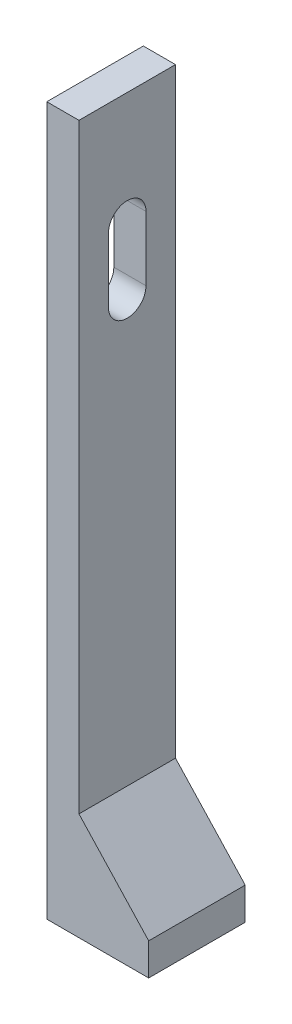
ISO-10303-21;
HEADER;
FILE_DESCRIPTION(('STEP AP214'),'2;1');
FILE_NAME('part.step','',(''),(''),'','','');
FILE_SCHEMA(('AUTOMOTIVE_DESIGN { 1 0 10303 214 1 1 1 1 }'));
ENDSEC;
DATA;
#1=APPLICATION_CONTEXT('core data for automotive mechanical design processes');
#2=APPLICATION_PROTOCOL_DEFINITION('international standard','automotive_design',2000,#1);
#3=PRODUCT_CONTEXT('',#1,'mechanical');
#4=PRODUCT('Part','Part','',(#3));
#5=PRODUCT_RELATED_PRODUCT_CATEGORY('part','',(#4));
#6=PRODUCT_DEFINITION_FORMATION('','',#4);
#7=PRODUCT_DEFINITION_CONTEXT('part definition',#1,'design');
#8=PRODUCT_DEFINITION('design','',#6,#7);
#9=PRODUCT_DEFINITION_SHAPE('','',#8);
#10=(LENGTH_UNIT() NAMED_UNIT(*) SI_UNIT(.MILLI.,.METRE.));
#11=(NAMED_UNIT(*) PLANE_ANGLE_UNIT() SI_UNIT($,.RADIAN.));
#12=(NAMED_UNIT(*) SI_UNIT($,.STERADIAN.) SOLID_ANGLE_UNIT());
#13=UNCERTAINTY_MEASURE_WITH_UNIT(LENGTH_MEASURE(1.E-05),#10,'distance_accuracy_value','');
#14=(GEOMETRIC_REPRESENTATION_CONTEXT(3) GLOBAL_UNCERTAINTY_ASSIGNED_CONTEXT((#13)) GLOBAL_UNIT_ASSIGNED_CONTEXT((#10,
#11,#12)) REPRESENTATION_CONTEXT('',''));
#15=CARTESIAN_POINT('',(0.,0.,0.));
#16=DIRECTION('',(0.,0.,1.));
#17=DIRECTION('',(1.,0.,0.));
#18=AXIS2_PLACEMENT_3D('',#15,#16,#17);
#19=CARTESIAN_POINT('',(0.,66.,9.));
#20=DIRECTION('',(1.,0.,0.));
#21=DIRECTION('',(0.,1.,0.));
#22=AXIS2_PLACEMENT_3D('',#19,#20,#21);
#23=PLANE('',#22);
#24=DIRECTION('',(0.,-1.,0.));
#25=VECTOR('',#24,1.);
#26=CARTESIAN_POINT('',(0.,55.52,2.75));
#27=LINE('',#26,#25);
#28=CARTESIAN_POINT('',(0.,55.52,2.75));
#29=VERTEX_POINT('',#28);
#30=CARTESIAN_POINT('',(0.,49.52,2.75));
#31=VERTEX_POINT('',#30);
#32=EDGE_CURVE('E137',#29,#31,#27,.T.);
#33=ORIENTED_EDGE('',*,*,#32,.F.);
#34=CARTESIAN_POINT('',(0.,55.52,4.5));
#35=DIRECTION('',(-1.,0.,0.));
#36=DIRECTION('',(0.,-1.,0.));
#37=AXIS2_PLACEMENT_3D('',#34,#35,#36);
#38=CIRCLE('',#37,1.75);
#39=CARTESIAN_POINT('',(0.,55.52,6.25000000000001));
#40=VERTEX_POINT('',#39);
#41=EDGE_CURVE('E56',#40,#29,#38,.T.);
#42=ORIENTED_EDGE('',*,*,#41,.F.);
#43=DIRECTION('',(0.,1.,0.));
#44=VECTOR('',#43,1.);
#45=CARTESIAN_POINT('',(0.,55.52,6.25000000000001));
#46=LINE('',#45,#44);
#47=CARTESIAN_POINT('',(0.,49.52,6.25000000000001));
#48=VERTEX_POINT('',#47);
#49=EDGE_CURVE('E143',#48,#40,#46,.T.);
#50=ORIENTED_EDGE('',*,*,#49,.F.);
#51=CARTESIAN_POINT('',(0.,49.52,4.50000000000001));
#52=DIRECTION('',(-1.,0.,0.));
#53=DIRECTION('',(0.,-1.,0.));
#54=AXIS2_PLACEMENT_3D('',#51,#52,#53);
#55=CIRCLE('',#54,1.75);
#56=EDGE_CURVE('E140',#31,#48,#55,.T.);
#57=ORIENTED_EDGE('',*,*,#56,.F.);
#58=EDGE_LOOP('',(#33,#42,#50,#57));
#59=FACE_BOUND('',#58,.T.);
#60=DIRECTION('',(0.,-1.,0.));
#61=VECTOR('',#60,1.);
#62=CARTESIAN_POINT('',(0.,66.,0.));
#63=LINE('',#62,#61);
#64=CARTESIAN_POINT('',(0.,66.,0.));
#65=VERTEX_POINT('',#64);
#66=CARTESIAN_POINT('',(0.,0.,0.));
#67=VERTEX_POINT('',#66);
#68=EDGE_CURVE('E149',#65,#67,#63,.T.);
#69=ORIENTED_EDGE('',*,*,#68,.T.);
#70=DIRECTION('',(0.,0.,-1.));
#71=VECTOR('',#70,1.);
#72=CARTESIAN_POINT('',(0.,0.,9.));
#73=LINE('',#72,#71);
#74=CARTESIAN_POINT('',(0.,0.,9.));
#75=VERTEX_POINT('',#74);
#76=EDGE_CURVE('E180',#75,#67,#73,.T.);
#77=ORIENTED_EDGE('',*,*,#76,.F.);
#78=DIRECTION('',(0.,-1.,0.));
#79=VECTOR('',#78,1.);
#80=CARTESIAN_POINT('',(0.,66.,9.));
#81=LINE('',#80,#79);
#82=CARTESIAN_POINT('',(0.,66.,9.));
#83=VERTEX_POINT('',#82);
#84=EDGE_CURVE('E155',#83,#75,#81,.T.);
#85=ORIENTED_EDGE('',*,*,#84,.F.);
#86=DIRECTION('',(0.,0.,-1.));
#87=VECTOR('',#86,1.);
#88=CARTESIAN_POINT('',(0.,66.,9.));
#89=LINE('',#88,#87);
#90=EDGE_CURVE('E165',#83,#65,#89,.T.);
#91=ORIENTED_EDGE('',*,*,#90,.T.);
#92=EDGE_LOOP('',(#69,#77,#85,#91));
#93=FACE_BOUND('',#92,.T.);
#94=ADVANCED_FACE('F34',(#59,#93),#23,.F.);
#95=CARTESIAN_POINT('',(0.,0.,9.));
#96=DIRECTION('',(0.,1.,0.));
#97=DIRECTION('',(0.,0.,1.));
#98=AXIS2_PLACEMENT_3D('',#95,#96,#97);
#99=PLANE('',#98);
#100=DIRECTION('',(1.,0.,0.));
#101=VECTOR('',#100,1.);
#102=CARTESIAN_POINT('',(0.,0.,0.));
#103=LINE('',#102,#101);
#104=CARTESIAN_POINT('',(9.5,0.,0.));
#105=VERTEX_POINT('',#104);
#106=EDGE_CURVE('E168',#67,#105,#103,.T.);
#107=ORIENTED_EDGE('',*,*,#106,.T.);
#108=DIRECTION('',(0.,0.,-1.));
#109=VECTOR('',#108,1.);
#110=CARTESIAN_POINT('',(9.5,0.,9.));
#111=LINE('',#110,#109);
#112=CARTESIAN_POINT('',(9.5,0.,9.));
#113=VERTEX_POINT('',#112);
#114=EDGE_CURVE('E177',#113,#105,#111,.T.);
#115=ORIENTED_EDGE('',*,*,#114,.F.);
#116=DIRECTION('',(1.,0.,0.));
#117=VECTOR('',#116,1.);
#118=CARTESIAN_POINT('',(0.,0.,9.));
#119=LINE('',#118,#117);
#120=EDGE_CURVE('E158',#75,#113,#119,.T.);
#121=ORIENTED_EDGE('',*,*,#120,.F.);
#122=ORIENTED_EDGE('',*,*,#76,.T.);
#123=EDGE_LOOP('',(#107,#115,#121,#122));
#124=FACE_BOUND('',#123,.T.);
#125=ADVANCED_FACE('F217',(#124),#99,.F.);
#126=CARTESIAN_POINT('',(9.5,0.,9.));
#127=DIRECTION('',(-1.,0.,0.));
#128=DIRECTION('',(0.,0.,1.));
#129=AXIS2_PLACEMENT_3D('',#126,#127,#128);
#130=PLANE('',#129);
#131=DIRECTION('',(0.,1.,0.));
#132=VECTOR('',#131,1.);
#133=CARTESIAN_POINT('',(9.5,0.,0.));
#134=LINE('',#133,#132);
#135=CARTESIAN_POINT('',(9.5,3.,0.));
#136=VERTEX_POINT('',#135);
#137=EDGE_CURVE('E120',#105,#136,#134,.T.);
#138=ORIENTED_EDGE('',*,*,#137,.T.);
#139=DIRECTION('',(0.,0.,-1.));
#140=VECTOR('',#139,1.);
#141=CARTESIAN_POINT('',(9.5,3.,9.));
#142=LINE('',#141,#140);
#143=CARTESIAN_POINT('',(9.5,3.,9.));
#144=VERTEX_POINT('',#143);
#145=EDGE_CURVE('E131',#144,#136,#142,.T.);
#146=ORIENTED_EDGE('',*,*,#145,.F.);
#147=DIRECTION('',(0.,1.,0.));
#148=VECTOR('',#147,1.);
#149=CARTESIAN_POINT('',(9.5,0.,9.));
#150=LINE('',#149,#148);
#151=EDGE_CURVE('E160',#113,#144,#150,.T.);
#152=ORIENTED_EDGE('',*,*,#151,.F.);
#153=ORIENTED_EDGE('',*,*,#114,.T.);
#154=EDGE_LOOP('',(#138,#146,#152,#153));
#155=FACE_BOUND('',#154,.T.);
#156=ADVANCED_FACE('F221',(#155),#130,.F.);
#157=CARTESIAN_POINT('',(3.,3.,9.));
#158=DIRECTION('',(-1.,0.,0.));
#159=DIRECTION('',(0.,0.,1.));
#160=AXIS2_PLACEMENT_3D('',#157,#158,#159);
#161=PLANE('',#160);
#162=DIRECTION('',(0.,1.,0.));
#163=VECTOR('',#162,1.);
#164=CARTESIAN_POINT('',(3.,3.,6.25000000000002));
#165=LINE('',#164,#163);
#166=CARTESIAN_POINT('',(3.,49.52,6.25000000000001));
#167=VERTEX_POINT('',#166);
#168=CARTESIAN_POINT('',(3.,55.52,6.25000000000001));
#169=VERTEX_POINT('',#168);
#170=EDGE_CURVE('E41',#167,#169,#165,.T.);
#171=ORIENTED_EDGE('',*,*,#170,.T.);
#172=CARTESIAN_POINT('',(3.,55.52,4.5));
#173=DIRECTION('',(-1.,0.,0.));
#174=DIRECTION('',(0.,0.,1.));
#175=AXIS2_PLACEMENT_3D('',#172,#173,#174);
#176=CIRCLE('',#175,1.75);
#177=CARTESIAN_POINT('',(3.,55.52,2.75));
#178=VERTEX_POINT('',#177);
#179=EDGE_CURVE('E11',#169,#178,#176,.T.);
#180=ORIENTED_EDGE('',*,*,#179,.T.);
#181=DIRECTION('',(0.,-1.,0.));
#182=VECTOR('',#181,1.);
#183=CARTESIAN_POINT('',(3.,3.,2.75000000000002));
#184=LINE('',#183,#182);
#185=CARTESIAN_POINT('',(3.,49.52,2.75));
#186=VERTEX_POINT('',#185);
#187=EDGE_CURVE('E183',#178,#186,#184,.T.);
#188=ORIENTED_EDGE('',*,*,#187,.T.);
#189=CARTESIAN_POINT('',(3.,49.52,4.50000000000001));
#190=DIRECTION('',(-1.,0.,0.));
#191=DIRECTION('',(0.,0.,1.));
#192=AXIS2_PLACEMENT_3D('',#189,#190,#191);
#193=CIRCLE('',#192,1.75);
#194=EDGE_CURVE('E186',#186,#167,#193,.T.);
#195=ORIENTED_EDGE('',*,*,#194,.T.);
#196=EDGE_LOOP('',(#171,#180,#188,#195));
#197=FACE_BOUND('',#196,.T.);
#198=DIRECTION('',(0.,1.,0.));
#199=VECTOR('',#198,1.);
#200=CARTESIAN_POINT('',(3.,3.,9.));
#201=LINE('',#200,#199);
#202=CARTESIAN_POINT('',(3.,10.,9.));
#203=VERTEX_POINT('',#202);
#204=CARTESIAN_POINT('',(3.,66.,9.));
#205=VERTEX_POINT('',#204);
#206=EDGE_CURVE('E48',#203,#205,#201,.T.);
#207=ORIENTED_EDGE('',*,*,#206,.F.);
#208=DIRECTION('',(0.,0.,1.));
#209=VECTOR('',#208,1.);
#210=CARTESIAN_POINT('',(3.,10.,0.));
#211=LINE('',#210,#209);
#212=CARTESIAN_POINT('',(3.,10.,0.));
#213=VERTEX_POINT('',#212);
#214=EDGE_CURVE('E122',#213,#203,#211,.T.);
#215=ORIENTED_EDGE('',*,*,#214,.F.);
#216=DIRECTION('',(0.,1.,0.));
#217=VECTOR('',#216,1.);
#218=CARTESIAN_POINT('',(3.,3.,0.));
#219=LINE('',#218,#217);
#220=CARTESIAN_POINT('',(3.,66.,0.));
#221=VERTEX_POINT('',#220);
#222=EDGE_CURVE('E112',#213,#221,#219,.T.);
#223=ORIENTED_EDGE('',*,*,#222,.T.);
#224=DIRECTION('',(0.,0.,-1.));
#225=VECTOR('',#224,1.);
#226=CARTESIAN_POINT('',(3.,66.,9.));
#227=LINE('',#226,#225);
#228=EDGE_CURVE('E174',#205,#221,#227,.T.);
#229=ORIENTED_EDGE('',*,*,#228,.F.);
#230=EDGE_LOOP('',(#207,#215,#223,#229));
#231=FACE_BOUND('',#230,.T.);
#232=ADVANCED_FACE('F123',(#197,#231),#161,.F.);
#233=CARTESIAN_POINT('',(3.,66.,9.));
#234=DIRECTION('',(0.,-1.,0.));
#235=DIRECTION('',(0.,0.,-1.));
#236=AXIS2_PLACEMENT_3D('',#233,#234,#235);
#237=PLANE('',#236);
#238=DIRECTION('',(-1.,0.,0.));
#239=VECTOR('',#238,1.);
#240=CARTESIAN_POINT('',(3.,66.,0.));
#241=LINE('',#240,#239);
#242=EDGE_CURVE('E118',#221,#65,#241,.T.);
#243=ORIENTED_EDGE('',*,*,#242,.T.);
#244=ORIENTED_EDGE('',*,*,#90,.F.);
#245=DIRECTION('',(-1.,0.,0.));
#246=VECTOR('',#245,1.);
#247=CARTESIAN_POINT('',(3.,66.,9.));
#248=LINE('',#247,#246);
#249=EDGE_CURVE('E163',#205,#83,#248,.T.);
#250=ORIENTED_EDGE('',*,*,#249,.F.);
#251=ORIENTED_EDGE('',*,*,#228,.T.);
#252=EDGE_LOOP('',(#243,#244,#250,#251));
#253=FACE_BOUND('',#252,.T.);
#254=ADVANCED_FACE('F231',(#253),#237,.F.);
#255=CARTESIAN_POINT('',(0.,0.,9.));
#256=DIRECTION('',(0.,0.,1.));
#257=DIRECTION('',(1.,0.,0.));
#258=AXIS2_PLACEMENT_3D('',#255,#256,#257);
#259=PLANE('',#258);
#260=ORIENTED_EDGE('',*,*,#84,.T.);
#261=ORIENTED_EDGE('',*,*,#120,.T.);
#262=ORIENTED_EDGE('',*,*,#151,.T.);
#263=DIRECTION('',(-0.680451099367278,0.732793491626299,0.));
#264=VECTOR('',#263,1.);
#265=CARTESIAN_POINT('',(9.5,3.,9.));
#266=LINE('',#265,#264);
#267=EDGE_CURVE('E132',#144,#203,#266,.T.);
#268=ORIENTED_EDGE('',*,*,#267,.T.);
#269=ORIENTED_EDGE('',*,*,#206,.T.);
#270=ORIENTED_EDGE('',*,*,#249,.T.);
#271=EDGE_LOOP('',(#260,#261,#262,#268,#269,#270));
#272=FACE_BOUND('',#271,.T.);
#273=ADVANCED_FACE('F212',(#272),#259,.T.);
#274=CARTESIAN_POINT('',(0.,0.,0.));
#275=DIRECTION('',(0.,0.,1.));
#276=DIRECTION('',(1.,0.,0.));
#277=AXIS2_PLACEMENT_3D('',#274,#275,#276);
#278=PLANE('',#277);
#279=ORIENTED_EDGE('',*,*,#68,.F.);
#280=ORIENTED_EDGE('',*,*,#242,.F.);
#281=ORIENTED_EDGE('',*,*,#222,.F.);
#282=DIRECTION('',(-0.680451099367278,0.732793491626299,0.));
#283=VECTOR('',#282,1.);
#284=CARTESIAN_POINT('',(9.5,3.,0.));
#285=LINE('',#284,#283);
#286=EDGE_CURVE('E117',#136,#213,#285,.T.);
#287=ORIENTED_EDGE('',*,*,#286,.F.);
#288=ORIENTED_EDGE('',*,*,#137,.F.);
#289=ORIENTED_EDGE('',*,*,#106,.F.);
#290=EDGE_LOOP('',(#279,#280,#281,#287,#288,#289));
#291=FACE_BOUND('',#290,.T.);
#292=ADVANCED_FACE('F114',(#291),#278,.F.);
#293=CARTESIAN_POINT('',(9.5,55.52,4.5));
#294=DIRECTION('',(-1.,0.,0.));
#295=DIRECTION('',(0.,-1.,0.));
#296=AXIS2_PLACEMENT_3D('',#293,#294,#295);
#297=CYLINDRICAL_SURFACE('',#296,1.75);
#298=DIRECTION('',(-1.,0.,0.));
#299=VECTOR('',#298,1.);
#300=CARTESIAN_POINT('',(9.5,55.52,6.25000000000001));
#301=LINE('',#300,#299);
#302=EDGE_CURVE('E147',#169,#40,#301,.T.);
#303=ORIENTED_EDGE('',*,*,#302,.T.);
#304=ORIENTED_EDGE('',*,*,#41,.T.);
#305=DIRECTION('',(-1.,0.,0.));
#306=VECTOR('',#305,1.);
#307=CARTESIAN_POINT('',(9.5,55.52,2.75));
#308=LINE('',#307,#306);
#309=EDGE_CURVE('E146',#178,#29,#308,.T.);
#310=ORIENTED_EDGE('',*,*,#309,.F.);
#311=ORIENTED_EDGE('',*,*,#179,.F.);
#312=EDGE_LOOP('',(#303,#304,#310,#311));
#313=FACE_BOUND('',#312,.T.);
#314=ADVANCED_FACE('F204',(#313),#297,.F.);
#315=CARTESIAN_POINT('',(9.5,55.52,6.25000000000001));
#316=DIRECTION('',(0.,0.,1.));
#317=DIRECTION('',(0.,-1.,0.));
#318=AXIS2_PLACEMENT_3D('',#315,#316,#317);
#319=PLANE('',#318);
#320=DIRECTION('',(-1.,0.,0.));
#321=VECTOR('',#320,1.);
#322=CARTESIAN_POINT('',(9.5,49.52,6.25000000000001));
#323=LINE('',#322,#321);
#324=EDGE_CURVE('E150',#167,#48,#323,.T.);
#325=ORIENTED_EDGE('',*,*,#324,.T.);
#326=ORIENTED_EDGE('',*,*,#49,.T.);
#327=ORIENTED_EDGE('',*,*,#302,.F.);
#328=ORIENTED_EDGE('',*,*,#170,.F.);
#329=EDGE_LOOP('',(#325,#326,#327,#328));
#330=FACE_BOUND('',#329,.T.);
#331=ADVANCED_FACE('F194',(#330),#319,.F.);
#332=CARTESIAN_POINT('',(9.5,49.52,4.50000000000001));
#333=DIRECTION('',(-1.,0.,0.));
#334=DIRECTION('',(0.,-1.,0.));
#335=AXIS2_PLACEMENT_3D('',#332,#333,#334);
#336=CYLINDRICAL_SURFACE('',#335,1.75);
#337=DIRECTION('',(-1.,0.,0.));
#338=VECTOR('',#337,1.);
#339=CARTESIAN_POINT('',(9.5,49.52,2.75));
#340=LINE('',#339,#338);
#341=EDGE_CURVE('E152',#186,#31,#340,.T.);
#342=ORIENTED_EDGE('',*,*,#341,.T.);
#343=ORIENTED_EDGE('',*,*,#56,.T.);
#344=ORIENTED_EDGE('',*,*,#324,.F.);
#345=ORIENTED_EDGE('',*,*,#194,.F.);
#346=EDGE_LOOP('',(#342,#343,#344,#345));
#347=FACE_BOUND('',#346,.T.);
#348=ADVANCED_FACE('F196',(#347),#336,.F.);
#349=CARTESIAN_POINT('',(9.5,55.52,2.75));
#350=DIRECTION('',(0.,0.,-1.));
#351=DIRECTION('',(0.,1.,0.));
#352=AXIS2_PLACEMENT_3D('',#349,#350,#351);
#353=PLANE('',#352);
#354=ORIENTED_EDGE('',*,*,#309,.T.);
#355=ORIENTED_EDGE('',*,*,#32,.T.);
#356=ORIENTED_EDGE('',*,*,#341,.F.);
#357=ORIENTED_EDGE('',*,*,#187,.F.);
#358=EDGE_LOOP('',(#354,#355,#356,#357));
#359=FACE_BOUND('',#358,.T.);
#360=ADVANCED_FACE('F203',(#359),#353,.F.);
#361=CARTESIAN_POINT('',(9.5,3.,0.));
#362=DIRECTION('',(0.732793491626299,0.680451099367278,0.));
#363=DIRECTION('',(-0.680451099367278,0.732793491626299,0.));
#364=AXIS2_PLACEMENT_3D('',#361,#362,#363);
#365=PLANE('',#364);
#366=ORIENTED_EDGE('',*,*,#267,.F.);
#367=ORIENTED_EDGE('',*,*,#145,.T.);
#368=ORIENTED_EDGE('',*,*,#286,.T.);
#369=ORIENTED_EDGE('',*,*,#214,.T.);
#370=EDGE_LOOP('',(#366,#367,#368,#369));
#371=FACE_BOUND('',#370,.T.);
#372=ADVANCED_FACE('F129',(#371),#365,.T.);
#373=CLOSED_SHELL('',(#94,#125,#156,#232,#254,#273,#292,#314,#331,#348,#360,#372));
#374=MANIFOLD_SOLID_BREP('B2',#373);
#375=ADVANCED_BREP_SHAPE_REPRESENTATION('',(#18,#374),#14);
#376=SHAPE_DEFINITION_REPRESENTATION(#9,#375);
ENDSEC;
END-ISO-10303-21;
